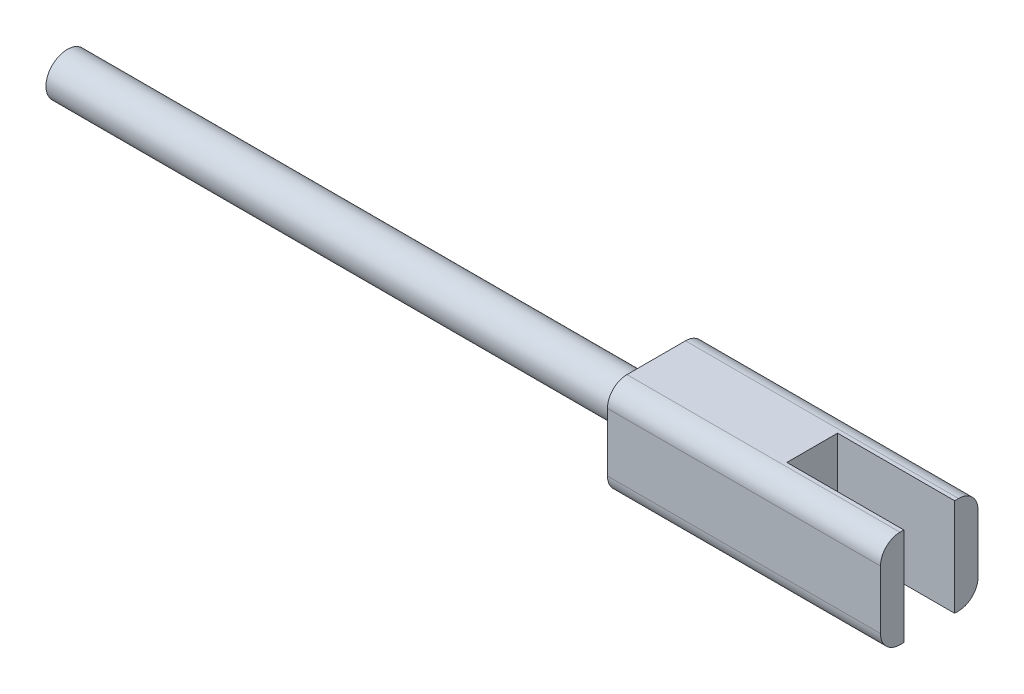
ISO-10303-21;
HEADER;
FILE_DESCRIPTION(('STEP AP214'),'2;1');
FILE_NAME('part.step','',(''),(''),'','','');
FILE_SCHEMA(('AUTOMOTIVE_DESIGN { 1 0 10303 214 1 1 1 1 }'));
ENDSEC;
DATA;
#1=APPLICATION_CONTEXT('core data for automotive mechanical design processes');
#2=APPLICATION_PROTOCOL_DEFINITION('international standard','automotive_design',2000,#1);
#3=PRODUCT_CONTEXT('',#1,'mechanical');
#4=PRODUCT('Part','Part','',(#3));
#5=PRODUCT_RELATED_PRODUCT_CATEGORY('part','',(#4));
#6=PRODUCT_DEFINITION_FORMATION('','',#4);
#7=PRODUCT_DEFINITION_CONTEXT('part definition',#1,'design');
#8=PRODUCT_DEFINITION('design','',#6,#7);
#9=PRODUCT_DEFINITION_SHAPE('','',#8);
#10=(LENGTH_UNIT() NAMED_UNIT(*) SI_UNIT(.MILLI.,.METRE.));
#11=(NAMED_UNIT(*) PLANE_ANGLE_UNIT() SI_UNIT($,.RADIAN.));
#12=(NAMED_UNIT(*) SI_UNIT($,.STERADIAN.) SOLID_ANGLE_UNIT());
#13=UNCERTAINTY_MEASURE_WITH_UNIT(LENGTH_MEASURE(1.E-05),#10,'distance_accuracy_value','');
#14=(GEOMETRIC_REPRESENTATION_CONTEXT(3) GLOBAL_UNCERTAINTY_ASSIGNED_CONTEXT((#13)) GLOBAL_UNIT_ASSIGNED_CONTEXT((#10,
#11,#12)) REPRESENTATION_CONTEXT('',''));
#15=CARTESIAN_POINT('',(0.,0.,0.));
#16=DIRECTION('',(0.,0.,1.));
#17=DIRECTION('',(1.,0.,0.));
#18=AXIS2_PLACEMENT_3D('',#15,#16,#17);
#19=CARTESIAN_POINT('',(44.2,-1.5,1.5));
#20=DIRECTION('',(1.,0.,0.));
#21=DIRECTION('',(0.,0.,-1.));
#22=AXIS2_PLACEMENT_3D('',#19,#20,#21);
#23=PLANE('',#22);
#24=DIRECTION('',(0.,1.,0.));
#25=VECTOR('',#24,1.);
#26=CARTESIAN_POINT('',(44.2,-1.5,-1.3));
#27=LINE('',#26,#25);
#28=CARTESIAN_POINT('',(44.2,-2.5,-1.3));
#29=VERTEX_POINT('',#28);
#30=CARTESIAN_POINT('',(44.2,2.5,-1.3));
#31=VERTEX_POINT('',#30);
#32=EDGE_CURVE('E11',#29,#31,#27,.T.);
#33=ORIENTED_EDGE('',*,*,#32,.F.);
#34=DIRECTION('',(0.,0.,-1.));
#35=VECTOR('',#34,1.);
#36=CARTESIAN_POINT('',(44.2,-2.5,1.5));
#37=LINE('',#36,#35);
#38=CARTESIAN_POINT('',(44.2,-2.5,-1.5));
#39=VERTEX_POINT('',#38);
#40=EDGE_CURVE('E202',#29,#39,#37,.T.);
#41=ORIENTED_EDGE('',*,*,#40,.T.);
#42=CARTESIAN_POINT('',(44.2,-1.5,-1.5));
#43=DIRECTION('',(1.,0.,0.));
#44=DIRECTION('',(0.,0.,-1.));
#45=AXIS2_PLACEMENT_3D('',#42,#43,#44);
#46=CIRCLE('',#45,1.);
#47=CARTESIAN_POINT('',(44.2,-1.5,-2.5));
#48=VERTEX_POINT('',#47);
#49=EDGE_CURVE('E201',#39,#48,#46,.T.);
#50=ORIENTED_EDGE('',*,*,#49,.T.);
#51=DIRECTION('',(0.,1.,0.));
#52=VECTOR('',#51,1.);
#53=CARTESIAN_POINT('',(44.2,-1.5,-2.5));
#54=LINE('',#53,#52);
#55=CARTESIAN_POINT('',(44.2,1.5,-2.5));
#56=VERTEX_POINT('',#55);
#57=EDGE_CURVE('E204',#48,#56,#54,.T.);
#58=ORIENTED_EDGE('',*,*,#57,.T.);
#59=CARTESIAN_POINT('',(44.2,1.5,-1.5));
#60=DIRECTION('',(1.,0.,0.));
#61=DIRECTION('',(0.,0.,-1.));
#62=AXIS2_PLACEMENT_3D('',#59,#60,#61);
#63=CIRCLE('',#62,1.);
#64=CARTESIAN_POINT('',(44.2,2.5,-1.5));
#65=VERTEX_POINT('',#64);
#66=EDGE_CURVE('E129',#56,#65,#63,.T.);
#67=ORIENTED_EDGE('',*,*,#66,.T.);
#68=DIRECTION('',(0.,0.,1.));
#69=VECTOR('',#68,1.);
#70=CARTESIAN_POINT('',(44.2,2.5,-1.5));
#71=LINE('',#70,#69);
#72=EDGE_CURVE('E128',#65,#31,#71,.T.);
#73=ORIENTED_EDGE('',*,*,#72,.T.);
#74=EDGE_LOOP('',(#33,#41,#50,#58,#67,#73));
#75=FACE_BOUND('',#74,.T.);
#76=ADVANCED_FACE('F39',(#75),#23,.T.);
#77=CARTESIAN_POINT('',(32.2,0.,0.));
#78=DIRECTION('',(-1.,0.,0.));
#79=DIRECTION('',(0.,0.,1.));
#80=AXIS2_PLACEMENT_3D('',#77,#78,#79);
#81=CYLINDRICAL_SURFACE('',#80,1.09);
#82=CARTESIAN_POINT('',(0.,0.,0.));
#83=DIRECTION('',(1.,0.,0.));
#84=DIRECTION('',(0.,0.,-1.));
#85=AXIS2_PLACEMENT_3D('',#82,#83,#84);
#86=CIRCLE('',#85,1.09);
#87=CARTESIAN_POINT('',(0.,0.,-1.09));
#88=VERTEX_POINT('',#87);
#89=EDGE_CURVE('E181',#88,#88,#86,.T.);
#90=ORIENTED_EDGE('',*,*,#89,.T.);
#91=EDGE_LOOP('',(#90));
#92=FACE_BOUND('',#91,.T.);
#93=CARTESIAN_POINT('',(30.2,0.,0.));
#94=DIRECTION('',(1.,0.,0.));
#95=DIRECTION('',(0.,0.,-1.));
#96=AXIS2_PLACEMENT_3D('',#93,#94,#95);
#97=CIRCLE('',#96,1.09);
#98=CARTESIAN_POINT('',(30.2,0.,-1.09));
#99=VERTEX_POINT('',#98);
#100=EDGE_CURVE('E184',#99,#99,#97,.T.);
#101=ORIENTED_EDGE('',*,*,#100,.F.);
#102=EDGE_LOOP('',(#101));
#103=FACE_BOUND('',#102,.T.);
#104=ADVANCED_FACE('F41',(#92,#103),#81,.T.);
#105=CARTESIAN_POINT('',(0.,0.,0.));
#106=DIRECTION('',(1.,0.,0.));
#107=DIRECTION('',(0.,0.,-1.));
#108=AXIS2_PLACEMENT_3D('',#105,#106,#107);
#109=PLANE('',#108);
#110=ORIENTED_EDGE('',*,*,#89,.F.);
#111=EDGE_LOOP('',(#110));
#112=FACE_BOUND('',#111,.T.);
#113=ADVANCED_FACE('F264',(#112),#109,.F.);
#114=CARTESIAN_POINT('',(44.2,-1.5,1.5));
#115=DIRECTION('',(-1.,0.,0.));
#116=DIRECTION('',(0.,0.,1.));
#117=AXIS2_PLACEMENT_3D('',#114,#115,#116);
#118=CYLINDRICAL_SURFACE('',#117,1.);
#119=CARTESIAN_POINT('',(30.2,-1.5,1.5));
#120=DIRECTION('',(1.,0.,0.));
#121=DIRECTION('',(0.,0.,-1.));
#122=AXIS2_PLACEMENT_3D('',#119,#120,#121);
#123=CIRCLE('',#122,1.);
#124=CARTESIAN_POINT('',(30.2,-1.5,2.5));
#125=VERTEX_POINT('',#124);
#126=CARTESIAN_POINT('',(30.2,-2.5,1.5));
#127=VERTEX_POINT('',#126);
#128=EDGE_CURVE('E150',#125,#127,#123,.T.);
#129=ORIENTED_EDGE('',*,*,#128,.T.);
#130=DIRECTION('',(-1.,0.,0.));
#131=VECTOR('',#130,1.);
#132=CARTESIAN_POINT('',(44.2,-2.5,1.5));
#133=LINE('',#132,#131);
#134=CARTESIAN_POINT('',(44.2,-2.5,1.5));
#135=VERTEX_POINT('',#134);
#136=EDGE_CURVE('E179',#135,#127,#133,.T.);
#137=ORIENTED_EDGE('',*,*,#136,.F.);
#138=CARTESIAN_POINT('',(44.2,-1.5,1.5));
#139=DIRECTION('',(1.,0.,0.));
#140=DIRECTION('',(0.,0.,-1.));
#141=AXIS2_PLACEMENT_3D('',#138,#139,#140);
#142=CIRCLE('',#141,1.);
#143=CARTESIAN_POINT('',(44.2,-1.5,2.5));
#144=VERTEX_POINT('',#143);
#145=EDGE_CURVE('E166',#144,#135,#142,.T.);
#146=ORIENTED_EDGE('',*,*,#145,.F.);
#147=DIRECTION('',(-1.,0.,0.));
#148=VECTOR('',#147,1.);
#149=CARTESIAN_POINT('',(44.2,-1.5,2.5));
#150=LINE('',#149,#148);
#151=EDGE_CURVE('E145',#144,#125,#150,.T.);
#152=ORIENTED_EDGE('',*,*,#151,.T.);
#153=EDGE_LOOP('',(#129,#137,#146,#152));
#154=FACE_BOUND('',#153,.T.);
#155=ADVANCED_FACE('F262',(#154),#118,.T.);
#156=CARTESIAN_POINT('',(44.2,-2.5,1.5));
#157=DIRECTION('',(0.,1.,0.));
#158=DIRECTION('',(0.,0.,1.));
#159=AXIS2_PLACEMENT_3D('',#156,#157,#158);
#160=PLANE('',#159);
#161=ORIENTED_EDGE('',*,*,#40,.F.);
#162=DIRECTION('',(-1.,0.,0.));
#163=VECTOR('',#162,1.);
#164=CARTESIAN_POINT('',(38.2,-2.5,-1.3));
#165=LINE('',#164,#163);
#166=CARTESIAN_POINT('',(38.2,-2.5,-1.3));
#167=VERTEX_POINT('',#166);
#168=EDGE_CURVE('E197',#29,#167,#165,.T.);
#169=ORIENTED_EDGE('',*,*,#168,.T.);
#170=DIRECTION('',(0.,0.,1.));
#171=VECTOR('',#170,1.);
#172=CARTESIAN_POINT('',(38.2,-2.5,1.3));
#173=LINE('',#172,#171);
#174=CARTESIAN_POINT('',(38.2,-2.5,1.3));
#175=VERTEX_POINT('',#174);
#176=EDGE_CURVE('E196',#167,#175,#173,.T.);
#177=ORIENTED_EDGE('',*,*,#176,.T.);
#178=DIRECTION('',(1.,0.,0.));
#179=VECTOR('',#178,1.);
#180=CARTESIAN_POINT('',(45.2,-2.5,1.3));
#181=LINE('',#180,#179);
#182=CARTESIAN_POINT('',(44.2,-2.5,1.3));
#183=VERTEX_POINT('',#182);
#184=EDGE_CURVE('E189',#175,#183,#181,.T.);
#185=ORIENTED_EDGE('',*,*,#184,.T.);
#186=EDGE_CURVE('E105',#135,#183,#37,.T.);
#187=ORIENTED_EDGE('',*,*,#186,.F.);
#188=ORIENTED_EDGE('',*,*,#136,.T.);
#189=DIRECTION('',(0.,0.,-1.));
#190=VECTOR('',#189,1.);
#191=CARTESIAN_POINT('',(30.2,-2.5,1.5));
#192=LINE('',#191,#190);
#193=CARTESIAN_POINT('',(30.2,-2.5,-1.5));
#194=VERTEX_POINT('',#193);
#195=EDGE_CURVE('E153',#127,#194,#192,.T.);
#196=ORIENTED_EDGE('',*,*,#195,.T.);
#197=DIRECTION('',(-1.,0.,0.));
#198=VECTOR('',#197,1.);
#199=CARTESIAN_POINT('',(44.2,-2.5,-1.5));
#200=LINE('',#199,#198);
#201=EDGE_CURVE('E176',#39,#194,#200,.T.);
#202=ORIENTED_EDGE('',*,*,#201,.F.);
#203=EDGE_LOOP('',(#161,#169,#177,#185,#187,#188,#196,#202));
#204=FACE_BOUND('',#203,.T.);
#205=ADVANCED_FACE('F193',(#204),#160,.F.);
#206=CARTESIAN_POINT('',(44.2,-1.5,-1.5));
#207=DIRECTION('',(-1.,0.,0.));
#208=DIRECTION('',(0.,0.,1.));
#209=AXIS2_PLACEMENT_3D('',#206,#207,#208);
#210=CYLINDRICAL_SURFACE('',#209,1.);
#211=CARTESIAN_POINT('',(30.2,-1.5,-1.5));
#212=DIRECTION('',(1.,0.,0.));
#213=DIRECTION('',(0.,0.,-1.));
#214=AXIS2_PLACEMENT_3D('',#211,#212,#213);
#215=CIRCLE('',#214,1.);
#216=CARTESIAN_POINT('',(30.2,-1.5,-2.5));
#217=VERTEX_POINT('',#216);
#218=EDGE_CURVE('E156',#194,#217,#215,.T.);
#219=ORIENTED_EDGE('',*,*,#218,.T.);
#220=DIRECTION('',(-1.,0.,0.));
#221=VECTOR('',#220,1.);
#222=CARTESIAN_POINT('',(44.2,-1.5,-2.5));
#223=LINE('',#222,#221);
#224=EDGE_CURVE('E173',#48,#217,#223,.T.);
#225=ORIENTED_EDGE('',*,*,#224,.F.);
#226=ORIENTED_EDGE('',*,*,#49,.F.);
#227=ORIENTED_EDGE('',*,*,#201,.T.);
#228=EDGE_LOOP('',(#219,#225,#226,#227));
#229=FACE_BOUND('',#228,.T.);
#230=ADVANCED_FACE('F253',(#229),#210,.T.);
#231=CARTESIAN_POINT('',(44.2,-1.5,-2.5));
#232=DIRECTION('',(0.,0.,1.));
#233=DIRECTION('',(1.,0.,0.));
#234=AXIS2_PLACEMENT_3D('',#231,#232,#233);
#235=PLANE('',#234);
#236=DIRECTION('',(0.,1.,0.));
#237=VECTOR('',#236,1.);
#238=CARTESIAN_POINT('',(30.2,-1.5,-2.5));
#239=LINE('',#238,#237);
#240=CARTESIAN_POINT('',(30.2,1.5,-2.5));
#241=VERTEX_POINT('',#240);
#242=EDGE_CURVE('E158',#217,#241,#239,.T.);
#243=ORIENTED_EDGE('',*,*,#242,.T.);
#244=DIRECTION('',(-1.,0.,0.));
#245=VECTOR('',#244,1.);
#246=CARTESIAN_POINT('',(44.2,1.5,-2.5));
#247=LINE('',#246,#245);
#248=EDGE_CURVE('E170',#56,#241,#247,.T.);
#249=ORIENTED_EDGE('',*,*,#248,.F.);
#250=ORIENTED_EDGE('',*,*,#57,.F.);
#251=ORIENTED_EDGE('',*,*,#224,.T.);
#252=EDGE_LOOP('',(#243,#249,#250,#251));
#253=FACE_BOUND('',#252,.T.);
#254=ADVANCED_FACE('F256',(#253),#235,.F.);
#255=CARTESIAN_POINT('',(44.2,1.5,-1.5));
#256=DIRECTION('',(-1.,0.,0.));
#257=DIRECTION('',(0.,0.,1.));
#258=AXIS2_PLACEMENT_3D('',#255,#256,#257);
#259=CYLINDRICAL_SURFACE('',#258,1.);
#260=CARTESIAN_POINT('',(30.2,1.5,-1.5));
#261=DIRECTION('',(1.,0.,0.));
#262=DIRECTION('',(0.,0.,-1.));
#263=AXIS2_PLACEMENT_3D('',#260,#261,#262);
#264=CIRCLE('',#263,1.);
#265=CARTESIAN_POINT('',(30.2,2.5,-1.5));
#266=VERTEX_POINT('',#265);
#267=EDGE_CURVE('E160',#241,#266,#264,.T.);
#268=ORIENTED_EDGE('',*,*,#267,.T.);
#269=DIRECTION('',(-1.,0.,0.));
#270=VECTOR('',#269,1.);
#271=CARTESIAN_POINT('',(44.2,2.5,-1.5));
#272=LINE('',#271,#270);
#273=EDGE_CURVE('E140',#65,#266,#272,.T.);
#274=ORIENTED_EDGE('',*,*,#273,.F.);
#275=ORIENTED_EDGE('',*,*,#66,.F.);
#276=ORIENTED_EDGE('',*,*,#248,.T.);
#277=EDGE_LOOP('',(#268,#274,#275,#276));
#278=FACE_BOUND('',#277,.T.);
#279=ADVANCED_FACE('F218',(#278),#259,.T.);
#280=CARTESIAN_POINT('',(44.2,2.5,-1.5));
#281=DIRECTION('',(0.,-1.,0.));
#282=DIRECTION('',(0.,0.,-1.));
#283=AXIS2_PLACEMENT_3D('',#280,#281,#282);
#284=PLANE('',#283);
#285=DIRECTION('',(0.,0.,1.));
#286=VECTOR('',#285,1.);
#287=CARTESIAN_POINT('',(38.2,2.5,1.3));
#288=LINE('',#287,#286);
#289=CARTESIAN_POINT('',(38.2,2.5,-1.3));
#290=VERTEX_POINT('',#289);
#291=CARTESIAN_POINT('',(38.2,2.5,1.3));
#292=VERTEX_POINT('',#291);
#293=EDGE_CURVE('E225',#290,#292,#288,.T.);
#294=ORIENTED_EDGE('',*,*,#293,.F.);
#295=DIRECTION('',(-1.,0.,0.));
#296=VECTOR('',#295,1.);
#297=CARTESIAN_POINT('',(38.2,2.5,-1.3));
#298=LINE('',#297,#296);
#299=EDGE_CURVE('E222',#31,#290,#298,.T.);
#300=ORIENTED_EDGE('',*,*,#299,.F.);
#301=ORIENTED_EDGE('',*,*,#72,.F.);
#302=ORIENTED_EDGE('',*,*,#273,.T.);
#303=DIRECTION('',(0.,0.,1.));
#304=VECTOR('',#303,1.);
#305=CARTESIAN_POINT('',(30.2,2.5,-1.5));
#306=LINE('',#305,#304);
#307=CARTESIAN_POINT('',(30.2,2.5,1.5));
#308=VERTEX_POINT('',#307);
#309=EDGE_CURVE('E137',#266,#308,#306,.T.);
#310=ORIENTED_EDGE('',*,*,#309,.T.);
#311=DIRECTION('',(-1.,0.,0.));
#312=VECTOR('',#311,1.);
#313=CARTESIAN_POINT('',(44.2,2.5,1.5));
#314=LINE('',#313,#312);
#315=CARTESIAN_POINT('',(44.2,2.5,1.5));
#316=VERTEX_POINT('',#315);
#317=EDGE_CURVE('E132',#316,#308,#314,.T.);
#318=ORIENTED_EDGE('',*,*,#317,.F.);
#319=CARTESIAN_POINT('',(44.2,2.5,1.3));
#320=VERTEX_POINT('',#319);
#321=EDGE_CURVE('E121',#320,#316,#71,.T.);
#322=ORIENTED_EDGE('',*,*,#321,.F.);
#323=DIRECTION('',(1.,0.,0.));
#324=VECTOR('',#323,1.);
#325=CARTESIAN_POINT('',(45.2,2.5,1.3));
#326=LINE('',#325,#324);
#327=EDGE_CURVE('E54',#292,#320,#326,.T.);
#328=ORIENTED_EDGE('',*,*,#327,.F.);
#329=EDGE_LOOP('',(#294,#300,#301,#302,#310,#318,#322,#328));
#330=FACE_BOUND('',#329,.T.);
#331=ADVANCED_FACE('F134',(#330),#284,.F.);
#332=CARTESIAN_POINT('',(44.2,1.5,1.5));
#333=DIRECTION('',(-1.,0.,0.));
#334=DIRECTION('',(0.,0.,1.));
#335=AXIS2_PLACEMENT_3D('',#332,#333,#334);
#336=CYLINDRICAL_SURFACE('',#335,1.);
#337=CARTESIAN_POINT('',(30.2,1.5,1.5));
#338=DIRECTION('',(1.,0.,0.));
#339=DIRECTION('',(0.,0.,-1.));
#340=AXIS2_PLACEMENT_3D('',#337,#338,#339);
#341=CIRCLE('',#340,1.);
#342=CARTESIAN_POINT('',(30.2,1.5,2.5));
#343=VERTEX_POINT('',#342);
#344=EDGE_CURVE('E163',#308,#343,#341,.T.);
#345=ORIENTED_EDGE('',*,*,#344,.T.);
#346=DIRECTION('',(-1.,0.,0.));
#347=VECTOR('',#346,1.);
#348=CARTESIAN_POINT('',(44.2,1.5,2.5));
#349=LINE('',#348,#347);
#350=CARTESIAN_POINT('',(44.2,1.5,2.5));
#351=VERTEX_POINT('',#350);
#352=EDGE_CURVE('E141',#351,#343,#349,.T.);
#353=ORIENTED_EDGE('',*,*,#352,.F.);
#354=CARTESIAN_POINT('',(44.2,1.5,1.5));
#355=DIRECTION('',(1.,0.,0.));
#356=DIRECTION('',(0.,0.,-1.));
#357=AXIS2_PLACEMENT_3D('',#354,#355,#356);
#358=CIRCLE('',#357,1.);
#359=EDGE_CURVE('E125',#316,#351,#358,.T.);
#360=ORIENTED_EDGE('',*,*,#359,.F.);
#361=ORIENTED_EDGE('',*,*,#317,.T.);
#362=EDGE_LOOP('',(#345,#353,#360,#361));
#363=FACE_BOUND('',#362,.T.);
#364=ADVANCED_FACE('F143',(#363),#336,.T.);
#365=CARTESIAN_POINT('',(44.2,1.5,2.5));
#366=DIRECTION('',(0.,0.,-1.));
#367=DIRECTION('',(-1.,0.,0.));
#368=AXIS2_PLACEMENT_3D('',#365,#366,#367);
#369=PLANE('',#368);
#370=DIRECTION('',(0.,-1.,0.));
#371=VECTOR('',#370,1.);
#372=CARTESIAN_POINT('',(30.2,1.5,2.5));
#373=LINE('',#372,#371);
#374=EDGE_CURVE('E96',#343,#125,#373,.T.);
#375=ORIENTED_EDGE('',*,*,#374,.T.);
#376=ORIENTED_EDGE('',*,*,#151,.F.);
#377=DIRECTION('',(0.,-1.,0.));
#378=VECTOR('',#377,1.);
#379=CARTESIAN_POINT('',(44.2,1.5,2.5));
#380=LINE('',#379,#378);
#381=EDGE_CURVE('E63',#351,#144,#380,.T.);
#382=ORIENTED_EDGE('',*,*,#381,.F.);
#383=ORIENTED_EDGE('',*,*,#352,.T.);
#384=EDGE_LOOP('',(#375,#376,#382,#383));
#385=FACE_BOUND('',#384,.T.);
#386=ADVANCED_FACE('F260',(#385),#369,.F.);
#387=DIRECTION('',(0.,-1.,0.));
#388=VECTOR('',#387,1.);
#389=CARTESIAN_POINT('',(44.2,-1.5,1.3));
#390=LINE('',#389,#388);
#391=EDGE_CURVE('E47',#320,#183,#390,.T.);
#392=ORIENTED_EDGE('',*,*,#391,.F.);
#393=ORIENTED_EDGE('',*,*,#321,.T.);
#394=ORIENTED_EDGE('',*,*,#359,.T.);
#395=ORIENTED_EDGE('',*,*,#381,.T.);
#396=ORIENTED_EDGE('',*,*,#145,.T.);
#397=ORIENTED_EDGE('',*,*,#186,.T.);
#398=EDGE_LOOP('',(#392,#393,#394,#395,#396,#397));
#399=FACE_BOUND('',#398,.T.);
#400=ADVANCED_FACE('F123',(#399),#23,.T.);
#401=CARTESIAN_POINT('',(30.2,-1.5,1.5));
#402=DIRECTION('',(1.,0.,0.));
#403=DIRECTION('',(0.,0.,-1.));
#404=AXIS2_PLACEMENT_3D('',#401,#402,#403);
#405=PLANE('',#404);
#406=ORIENTED_EDGE('',*,*,#100,.T.);
#407=EDGE_LOOP('',(#406));
#408=FACE_BOUND('',#407,.T.);
#409=ORIENTED_EDGE('',*,*,#128,.F.);
#410=ORIENTED_EDGE('',*,*,#374,.F.);
#411=ORIENTED_EDGE('',*,*,#344,.F.);
#412=ORIENTED_EDGE('',*,*,#309,.F.);
#413=ORIENTED_EDGE('',*,*,#267,.F.);
#414=ORIENTED_EDGE('',*,*,#242,.F.);
#415=ORIENTED_EDGE('',*,*,#218,.F.);
#416=ORIENTED_EDGE('',*,*,#195,.F.);
#417=EDGE_LOOP('',(#409,#410,#411,#412,#413,#414,#415,#416));
#418=FACE_BOUND('',#417,.T.);
#419=ADVANCED_FACE('F259',(#408,#418),#405,.F.);
#420=CARTESIAN_POINT('',(38.2,-2.5,1.3));
#421=DIRECTION('',(-1.,0.,0.));
#422=DIRECTION('',(0.,0.,1.));
#423=AXIS2_PLACEMENT_3D('',#420,#421,#422);
#424=PLANE('',#423);
#425=DIRECTION('',(0.,1.,0.));
#426=VECTOR('',#425,1.);
#427=CARTESIAN_POINT('',(38.2,-2.5,1.3));
#428=LINE('',#427,#426);
#429=EDGE_CURVE('E237',#175,#292,#428,.T.);
#430=ORIENTED_EDGE('',*,*,#429,.F.);
#431=ORIENTED_EDGE('',*,*,#176,.F.);
#432=DIRECTION('',(0.,1.,0.));
#433=VECTOR('',#432,1.);
#434=CARTESIAN_POINT('',(38.2,-2.5,-1.3));
#435=LINE('',#434,#433);
#436=EDGE_CURVE('E154',#167,#290,#435,.T.);
#437=ORIENTED_EDGE('',*,*,#436,.T.);
#438=ORIENTED_EDGE('',*,*,#293,.T.);
#439=EDGE_LOOP('',(#430,#431,#437,#438));
#440=FACE_BOUND('',#439,.T.);
#441=ADVANCED_FACE('F242',(#440),#424,.F.);
#442=CARTESIAN_POINT('',(38.2,-2.5,-1.3));
#443=DIRECTION('',(0.,0.,-1.));
#444=DIRECTION('',(-1.,0.,0.));
#445=AXIS2_PLACEMENT_3D('',#442,#443,#444);
#446=PLANE('',#445);
#447=ORIENTED_EDGE('',*,*,#32,.T.);
#448=ORIENTED_EDGE('',*,*,#299,.T.);
#449=ORIENTED_EDGE('',*,*,#436,.F.);
#450=ORIENTED_EDGE('',*,*,#168,.F.);
#451=EDGE_LOOP('',(#447,#448,#449,#450));
#452=FACE_BOUND('',#451,.T.);
#453=ADVANCED_FACE('F245',(#452),#446,.F.);
#454=CARTESIAN_POINT('',(45.2,-2.5,1.3));
#455=DIRECTION('',(0.,0.,1.));
#456=DIRECTION('',(1.,0.,0.));
#457=AXIS2_PLACEMENT_3D('',#454,#455,#456);
#458=PLANE('',#457);
#459=ORIENTED_EDGE('',*,*,#391,.T.);
#460=ORIENTED_EDGE('',*,*,#184,.F.);
#461=ORIENTED_EDGE('',*,*,#429,.T.);
#462=ORIENTED_EDGE('',*,*,#327,.T.);
#463=EDGE_LOOP('',(#459,#460,#461,#462));
#464=FACE_BOUND('',#463,.T.);
#465=ADVANCED_FACE('F187',(#464),#458,.F.);
#466=CLOSED_SHELL('',(#76,#104,#113,#155,#205,#230,#254,#279,#331,#364,#386,#400,#419,#441,#453,#465));
#467=MANIFOLD_SOLID_BREP('B2',#466);
#468=ADVANCED_BREP_SHAPE_REPRESENTATION('',(#18,#467),#14);
#469=SHAPE_DEFINITION_REPRESENTATION(#9,#468);
ENDSEC;
END-ISO-10303-21;
